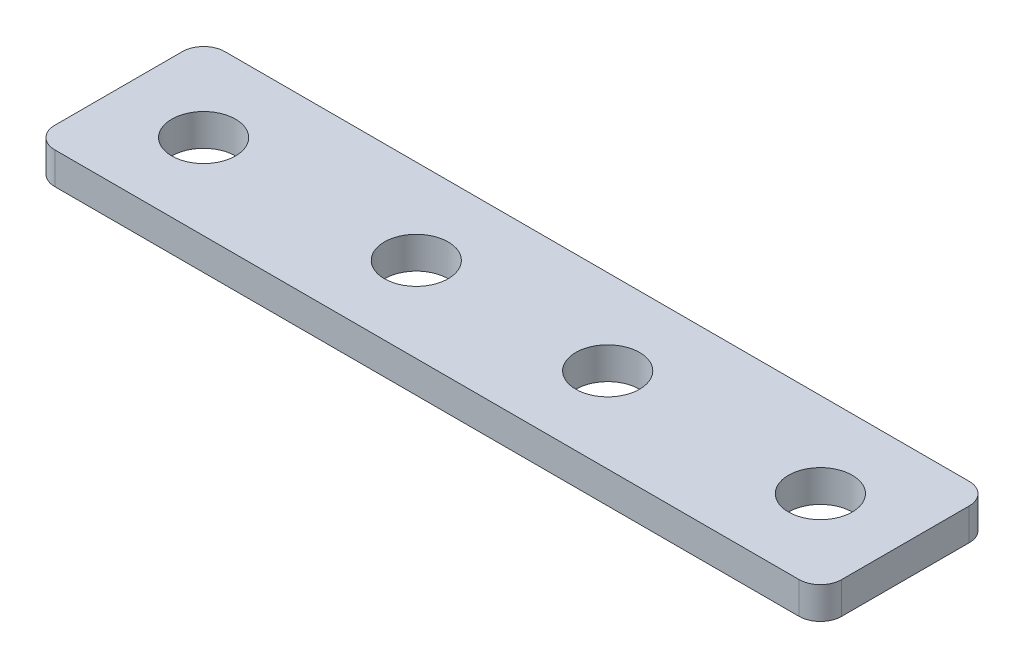
ISO-10303-21;
HEADER;
FILE_DESCRIPTION(('STEP AP214'),'2;1');
FILE_NAME('part.step','',(''),(''),'','','');
FILE_SCHEMA(('AUTOMOTIVE_DESIGN { 1 0 10303 214 1 1 1 1 }'));
ENDSEC;
DATA;
#1=APPLICATION_CONTEXT('core data for automotive mechanical design processes');
#2=APPLICATION_PROTOCOL_DEFINITION('international standard','automotive_design',2000,#1);
#3=PRODUCT_CONTEXT('',#1,'mechanical');
#4=PRODUCT('Part','Part','',(#3));
#5=PRODUCT_RELATED_PRODUCT_CATEGORY('part','',(#4));
#6=PRODUCT_DEFINITION_FORMATION('','',#4);
#7=PRODUCT_DEFINITION_CONTEXT('part definition',#1,'design');
#8=PRODUCT_DEFINITION('design','',#6,#7);
#9=PRODUCT_DEFINITION_SHAPE('','',#8);
#10=(LENGTH_UNIT() NAMED_UNIT(*) SI_UNIT(.MILLI.,.METRE.));
#11=(NAMED_UNIT(*) PLANE_ANGLE_UNIT() SI_UNIT($,.RADIAN.));
#12=(NAMED_UNIT(*) SI_UNIT($,.STERADIAN.) SOLID_ANGLE_UNIT());
#13=UNCERTAINTY_MEASURE_WITH_UNIT(LENGTH_MEASURE(1.E-05),#10,'distance_accuracy_value','');
#14=(GEOMETRIC_REPRESENTATION_CONTEXT(3) GLOBAL_UNCERTAINTY_ASSIGNED_CONTEXT((#13)) GLOBAL_UNIT_ASSIGNED_CONTEXT((#10,
#11,#12)) REPRESENTATION_CONTEXT('',''));
#15=CARTESIAN_POINT('',(0.,0.,0.));
#16=DIRECTION('',(0.,0.,1.));
#17=DIRECTION('',(1.,0.,0.));
#18=AXIS2_PLACEMENT_3D('',#15,#16,#17);
#19=CARTESIAN_POINT('',(0.,1.5,0.));
#20=DIRECTION('',(0.,0.,-1.));
#21=DIRECTION('',(-1.,0.,0.));
#22=AXIS2_PLACEMENT_3D('',#19,#20,#21);
#23=PLANE('',#22);
#24=DIRECTION('',(1.,0.,0.));
#25=VECTOR('',#24,1.);
#26=CARTESIAN_POINT('',(0.,0.,0.));
#27=LINE('',#26,#25);
#28=CARTESIAN_POINT('',(1.,0.,0.));
#29=VERTEX_POINT('',#28);
#30=CARTESIAN_POINT('',(36.,0.,0.));
#31=VERTEX_POINT('',#30);
#32=EDGE_CURVE('E185',#29,#31,#27,.T.);
#33=ORIENTED_EDGE('',*,*,#32,.T.);
#34=DIRECTION('',(0.,-1.,0.));
#35=VECTOR('',#34,1.);
#36=CARTESIAN_POINT('',(36.,1.5,0.));
#37=LINE('',#36,#35);
#38=CARTESIAN_POINT('',(36.,1.5,0.));
#39=VERTEX_POINT('',#38);
#40=EDGE_CURVE('E174',#31,#39,#37,.F.);
#41=ORIENTED_EDGE('',*,*,#40,.T.);
#42=DIRECTION('',(1.,0.,0.));
#43=VECTOR('',#42,1.);
#44=CARTESIAN_POINT('',(0.,1.5,0.));
#45=LINE('',#44,#43);
#46=CARTESIAN_POINT('',(1.,1.5,0.));
#47=VERTEX_POINT('',#46);
#48=EDGE_CURVE('E182',#47,#39,#45,.T.);
#49=ORIENTED_EDGE('',*,*,#48,.F.);
#50=DIRECTION('',(0.,-1.,0.));
#51=VECTOR('',#50,1.);
#52=CARTESIAN_POINT('',(1.,0.,0.));
#53=LINE('',#52,#51);
#54=EDGE_CURVE('E170',#47,#29,#53,.T.);
#55=ORIENTED_EDGE('',*,*,#54,.T.);
#56=EDGE_LOOP('',(#33,#41,#49,#55));
#57=FACE_BOUND('',#56,.T.);
#58=ADVANCED_FACE('F45',(#57),#23,.F.);
#59=CARTESIAN_POINT('',(37.,1.5,0.));
#60=DIRECTION('',(-1.,0.,0.));
#61=DIRECTION('',(0.,0.,1.));
#62=AXIS2_PLACEMENT_3D('',#59,#60,#61);
#63=PLANE('',#62);
#64=DIRECTION('',(0.,0.,-1.));
#65=VECTOR('',#64,1.);
#66=CARTESIAN_POINT('',(37.,0.,0.));
#67=LINE('',#66,#65);
#68=CARTESIAN_POINT('',(37.,0.,-1.));
#69=VERTEX_POINT('',#68);
#70=CARTESIAN_POINT('',(37.,0.,-7.));
#71=VERTEX_POINT('',#70);
#72=EDGE_CURVE('E132',#69,#71,#67,.T.);
#73=ORIENTED_EDGE('',*,*,#72,.T.);
#74=DIRECTION('',(0.,-1.,0.));
#75=VECTOR('',#74,1.);
#76=CARTESIAN_POINT('',(37.,1.5,-7.));
#77=LINE('',#76,#75);
#78=CARTESIAN_POINT('',(37.,1.5,-7.));
#79=VERTEX_POINT('',#78);
#80=EDGE_CURVE('E156',#71,#79,#77,.F.);
#81=ORIENTED_EDGE('',*,*,#80,.T.);
#82=DIRECTION('',(0.,0.,-1.));
#83=VECTOR('',#82,1.);
#84=CARTESIAN_POINT('',(37.,1.5,0.));
#85=LINE('',#84,#83);
#86=CARTESIAN_POINT('',(37.,1.5,-1.));
#87=VERTEX_POINT('',#86);
#88=EDGE_CURVE('E193',#87,#79,#85,.T.);
#89=ORIENTED_EDGE('',*,*,#88,.F.);
#90=DIRECTION('',(0.,-1.,0.));
#91=VECTOR('',#90,1.);
#92=CARTESIAN_POINT('',(37.,1.5,-1.));
#93=LINE('',#92,#91);
#94=EDGE_CURVE('E152',#87,#69,#93,.T.);
#95=ORIENTED_EDGE('',*,*,#94,.T.);
#96=EDGE_LOOP('',(#73,#81,#89,#95));
#97=FACE_BOUND('',#96,.T.);
#98=ADVANCED_FACE('F201',(#97),#63,.F.);
#99=CARTESIAN_POINT('',(0.,1.5,-8.));
#100=DIRECTION('',(0.,0.,-1.));
#101=DIRECTION('',(-1.,0.,0.));
#102=AXIS2_PLACEMENT_3D('',#99,#100,#101);
#103=PLANE('',#102);
#104=DIRECTION('',(1.,0.,0.));
#105=VECTOR('',#104,1.);
#106=CARTESIAN_POINT('',(0.,1.5,-8.));
#107=LINE('',#106,#105);
#108=CARTESIAN_POINT('',(1.,1.5,-8.));
#109=VERTEX_POINT('',#108);
#110=CARTESIAN_POINT('',(36.,1.5,-8.));
#111=VERTEX_POINT('',#110);
#112=EDGE_CURVE('E141',#109,#111,#107,.T.);
#113=ORIENTED_EDGE('',*,*,#112,.T.);
#114=DIRECTION('',(0.,-1.,0.));
#115=VECTOR('',#114,1.);
#116=CARTESIAN_POINT('',(36.,0.,-8.));
#117=LINE('',#116,#115);
#118=CARTESIAN_POINT('',(36.,0.,-8.));
#119=VERTEX_POINT('',#118);
#120=EDGE_CURVE('E130',#111,#119,#117,.T.);
#121=ORIENTED_EDGE('',*,*,#120,.T.);
#122=DIRECTION('',(1.,0.,0.));
#123=VECTOR('',#122,1.);
#124=CARTESIAN_POINT('',(0.,0.,-8.));
#125=LINE('',#124,#123);
#126=CARTESIAN_POINT('',(1.,0.,-8.));
#127=VERTEX_POINT('',#126);
#128=EDGE_CURVE('E115',#127,#119,#125,.T.);
#129=ORIENTED_EDGE('',*,*,#128,.F.);
#130=DIRECTION('',(0.,-1.,0.));
#131=VECTOR('',#130,1.);
#132=CARTESIAN_POINT('',(1.,1.5,-8.));
#133=LINE('',#132,#131);
#134=EDGE_CURVE('E128',#127,#109,#133,.F.);
#135=ORIENTED_EDGE('',*,*,#134,.T.);
#136=EDGE_LOOP('',(#113,#121,#129,#135));
#137=FACE_BOUND('',#136,.T.);
#138=ADVANCED_FACE('F127',(#137),#103,.T.);
#139=CARTESIAN_POINT('',(4.00000000000001,1.5,-4.));
#140=DIRECTION('',(0.,-1.,0.));
#141=DIRECTION('',(0.,0.,-1.));
#142=AXIS2_PLACEMENT_3D('',#139,#140,#141);
#143=CYLINDRICAL_SURFACE('',#142,1.5);
#144=CARTESIAN_POINT('',(4.00000000000001,1.5,-4.));
#145=DIRECTION('',(0.,1.,0.));
#146=DIRECTION('',(0.,0.,1.));
#147=AXIS2_PLACEMENT_3D('',#144,#145,#146);
#148=CIRCLE('',#147,1.5);
#149=CARTESIAN_POINT('',(4.00000000000001,1.5,-2.5));
#150=VERTEX_POINT('',#149);
#151=EDGE_CURVE('E194',#150,#150,#148,.F.);
#152=ORIENTED_EDGE('',*,*,#151,.F.);
#153=EDGE_LOOP('',(#152));
#154=FACE_BOUND('',#153,.T.);
#155=CARTESIAN_POINT('',(4.00000000000001,0.,-4.));
#156=DIRECTION('',(0.,1.,0.));
#157=DIRECTION('',(0.,0.,1.));
#158=AXIS2_PLACEMENT_3D('',#155,#156,#157);
#159=CIRCLE('',#158,1.5);
#160=CARTESIAN_POINT('',(4.00000000000001,0.,-2.5));
#161=VERTEX_POINT('',#160);
#162=EDGE_CURVE('E206',#161,#161,#159,.F.);
#163=ORIENTED_EDGE('',*,*,#162,.T.);
#164=EDGE_LOOP('',(#163));
#165=FACE_BOUND('',#164,.T.);
#166=ADVANCED_FACE('F258',(#154,#165),#143,.F.);
#167=CARTESIAN_POINT('',(14.,1.5,-4.));
#168=DIRECTION('',(0.,-1.,0.));
#169=DIRECTION('',(0.,0.,-1.));
#170=AXIS2_PLACEMENT_3D('',#167,#168,#169);
#171=CYLINDRICAL_SURFACE('',#170,1.5);
#172=CARTESIAN_POINT('',(14.,1.5,-4.));
#173=DIRECTION('',(0.,1.,0.));
#174=DIRECTION('',(0.,0.,1.));
#175=AXIS2_PLACEMENT_3D('',#172,#173,#174);
#176=CIRCLE('',#175,1.5);
#177=CARTESIAN_POINT('',(14.,1.5,-2.5));
#178=VERTEX_POINT('',#177);
#179=EDGE_CURVE('E231',#178,#178,#176,.F.);
#180=ORIENTED_EDGE('',*,*,#179,.F.);
#181=EDGE_LOOP('',(#180));
#182=FACE_BOUND('',#181,.T.);
#183=CARTESIAN_POINT('',(14.,0.,-4.));
#184=DIRECTION('',(0.,1.,0.));
#185=DIRECTION('',(0.,0.,1.));
#186=AXIS2_PLACEMENT_3D('',#183,#184,#185);
#187=CIRCLE('',#186,1.5);
#188=CARTESIAN_POINT('',(14.,0.,-2.5));
#189=VERTEX_POINT('',#188);
#190=EDGE_CURVE('E212',#189,#189,#187,.F.);
#191=ORIENTED_EDGE('',*,*,#190,.T.);
#192=EDGE_LOOP('',(#191));
#193=FACE_BOUND('',#192,.T.);
#194=ADVANCED_FACE('F261',(#182,#193),#171,.F.);
#195=CARTESIAN_POINT('',(23.,1.5,-4.));
#196=DIRECTION('',(0.,-1.,0.));
#197=DIRECTION('',(0.,0.,-1.));
#198=AXIS2_PLACEMENT_3D('',#195,#196,#197);
#199=CYLINDRICAL_SURFACE('',#198,1.5);
#200=CARTESIAN_POINT('',(23.,1.5,-4.));
#201=DIRECTION('',(0.,1.,0.));
#202=DIRECTION('',(0.,0.,1.));
#203=AXIS2_PLACEMENT_3D('',#200,#201,#202);
#204=CIRCLE('',#203,1.5);
#205=CARTESIAN_POINT('',(23.,1.5,-2.5));
#206=VERTEX_POINT('',#205);
#207=EDGE_CURVE('E235',#206,#206,#204,.T.);
#208=ORIENTED_EDGE('',*,*,#207,.T.);
#209=EDGE_LOOP('',(#208));
#210=FACE_BOUND('',#209,.T.);
#211=CARTESIAN_POINT('',(23.,0.,-4.));
#212=DIRECTION('',(0.,1.,0.));
#213=DIRECTION('',(0.,0.,1.));
#214=AXIS2_PLACEMENT_3D('',#211,#212,#213);
#215=CIRCLE('',#214,1.5);
#216=CARTESIAN_POINT('',(23.,0.,-2.5));
#217=VERTEX_POINT('',#216);
#218=EDGE_CURVE('E216',#217,#217,#215,.T.);
#219=ORIENTED_EDGE('',*,*,#218,.F.);
#220=EDGE_LOOP('',(#219));
#221=FACE_BOUND('',#220,.T.);
#222=ADVANCED_FACE('F286',(#210,#221),#199,.F.);
#223=CARTESIAN_POINT('',(33.,1.5,-4.));
#224=DIRECTION('',(0.,-1.,0.));
#225=DIRECTION('',(0.,0.,-1.));
#226=AXIS2_PLACEMENT_3D('',#223,#224,#225);
#227=CYLINDRICAL_SURFACE('',#226,1.5);
#228=CARTESIAN_POINT('',(33.,1.5,-4.));
#229=DIRECTION('',(0.,1.,0.));
#230=DIRECTION('',(0.,0.,1.));
#231=AXIS2_PLACEMENT_3D('',#228,#229,#230);
#232=CIRCLE('',#231,1.5);
#233=CARTESIAN_POINT('',(33.,1.5,-2.5));
#234=VERTEX_POINT('',#233);
#235=EDGE_CURVE('E239',#234,#234,#232,.T.);
#236=ORIENTED_EDGE('',*,*,#235,.T.);
#237=EDGE_LOOP('',(#236));
#238=FACE_BOUND('',#237,.T.);
#239=CARTESIAN_POINT('',(33.,0.,-4.));
#240=DIRECTION('',(0.,1.,0.));
#241=DIRECTION('',(0.,0.,1.));
#242=AXIS2_PLACEMENT_3D('',#239,#240,#241);
#243=CIRCLE('',#242,1.5);
#244=CARTESIAN_POINT('',(33.,0.,-2.5));
#245=VERTEX_POINT('',#244);
#246=EDGE_CURVE('E220',#245,#245,#243,.T.);
#247=ORIENTED_EDGE('',*,*,#246,.F.);
#248=EDGE_LOOP('',(#247));
#249=FACE_BOUND('',#248,.T.);
#250=ADVANCED_FACE('F245',(#238,#249),#227,.F.);
#251=CARTESIAN_POINT('',(0.,1.5,0.));
#252=DIRECTION('',(-1.,0.,0.));
#253=DIRECTION('',(0.,0.,1.));
#254=AXIS2_PLACEMENT_3D('',#251,#252,#253);
#255=PLANE('',#254);
#256=DIRECTION('',(0.,0.,-1.));
#257=VECTOR('',#256,1.);
#258=CARTESIAN_POINT('',(0.,1.5,0.));
#259=LINE('',#258,#257);
#260=CARTESIAN_POINT('',(0.,1.5,-1.));
#261=VERTEX_POINT('',#260);
#262=CARTESIAN_POINT('',(0.,1.5,-7.));
#263=VERTEX_POINT('',#262);
#264=EDGE_CURVE('E136',#261,#263,#259,.T.);
#265=ORIENTED_EDGE('',*,*,#264,.T.);
#266=DIRECTION('',(0.,-1.,0.));
#267=VECTOR('',#266,1.);
#268=CARTESIAN_POINT('',(0.,1.5,-7.));
#269=LINE('',#268,#267);
#270=CARTESIAN_POINT('',(0.,0.,-7.));
#271=VERTEX_POINT('',#270);
#272=EDGE_CURVE('E11',#263,#271,#269,.T.);
#273=ORIENTED_EDGE('',*,*,#272,.T.);
#274=DIRECTION('',(0.,0.,-1.));
#275=VECTOR('',#274,1.);
#276=CARTESIAN_POINT('',(0.,0.,0.));
#277=LINE('',#276,#275);
#278=CARTESIAN_POINT('',(0.,0.,-1.));
#279=VERTEX_POINT('',#278);
#280=EDGE_CURVE('E116',#279,#271,#277,.T.);
#281=ORIENTED_EDGE('',*,*,#280,.F.);
#282=DIRECTION('',(0.,-1.,0.));
#283=VECTOR('',#282,1.);
#284=CARTESIAN_POINT('',(0.,1.5,-1.));
#285=LINE('',#284,#283);
#286=EDGE_CURVE('E54',#279,#261,#285,.F.);
#287=ORIENTED_EDGE('',*,*,#286,.T.);
#288=EDGE_LOOP('',(#265,#273,#281,#287));
#289=FACE_BOUND('',#288,.T.);
#290=ADVANCED_FACE('F250',(#289),#255,.T.);
#291=CARTESIAN_POINT('',(0.,1.5,0.));
#292=DIRECTION('',(0.,1.,0.));
#293=DIRECTION('',(0.,0.,1.));
#294=AXIS2_PLACEMENT_3D('',#291,#292,#293);
#295=PLANE('',#294);
#296=ORIENTED_EDGE('',*,*,#235,.F.);
#297=EDGE_LOOP('',(#296));
#298=FACE_BOUND('',#297,.T.);
#299=ORIENTED_EDGE('',*,*,#207,.F.);
#300=EDGE_LOOP('',(#299));
#301=FACE_BOUND('',#300,.T.);
#302=ORIENTED_EDGE('',*,*,#179,.T.);
#303=EDGE_LOOP('',(#302));
#304=FACE_BOUND('',#303,.T.);
#305=ORIENTED_EDGE('',*,*,#151,.T.);
#306=EDGE_LOOP('',(#305));
#307=FACE_BOUND('',#306,.T.);
#308=ORIENTED_EDGE('',*,*,#88,.T.);
#309=CARTESIAN_POINT('',(36.,1.5,-7.));
#310=DIRECTION('',(0.,1.,0.));
#311=DIRECTION('',(0.,0.,1.));
#312=AXIS2_PLACEMENT_3D('',#309,#310,#311);
#313=CIRCLE('',#312,1.);
#314=EDGE_CURVE('E167',#79,#111,#313,.T.);
#315=ORIENTED_EDGE('',*,*,#314,.T.);
#316=ORIENTED_EDGE('',*,*,#112,.F.);
#317=CARTESIAN_POINT('',(1.,1.5,-7.));
#318=DIRECTION('',(0.,1.,0.));
#319=DIRECTION('',(0.,0.,1.));
#320=AXIS2_PLACEMENT_3D('',#317,#318,#319);
#321=CIRCLE('',#320,1.);
#322=EDGE_CURVE('E61',#109,#263,#321,.T.);
#323=ORIENTED_EDGE('',*,*,#322,.T.);
#324=ORIENTED_EDGE('',*,*,#264,.F.);
#325=CARTESIAN_POINT('',(1.,1.5,-1.));
#326=DIRECTION('',(0.,1.,0.));
#327=DIRECTION('',(0.,0.,1.));
#328=AXIS2_PLACEMENT_3D('',#325,#326,#327);
#329=CIRCLE('',#328,1.);
#330=EDGE_CURVE('E159',#261,#47,#329,.T.);
#331=ORIENTED_EDGE('',*,*,#330,.T.);
#332=ORIENTED_EDGE('',*,*,#48,.T.);
#333=CARTESIAN_POINT('',(36.,1.5,-1.));
#334=DIRECTION('',(0.,1.,0.));
#335=DIRECTION('',(0.,0.,1.));
#336=AXIS2_PLACEMENT_3D('',#333,#334,#335);
#337=CIRCLE('',#336,1.);
#338=EDGE_CURVE('E164',#39,#87,#337,.T.);
#339=ORIENTED_EDGE('',*,*,#338,.T.);
#340=EDGE_LOOP('',(#308,#315,#316,#323,#324,#331,#332,#339));
#341=FACE_BOUND('',#340,.T.);
#342=ADVANCED_FACE('F189',(#298,#301,#304,#307,#341),#295,.T.);
#343=CARTESIAN_POINT('',(0.,0.,0.));
#344=DIRECTION('',(0.,1.,0.));
#345=DIRECTION('',(0.,0.,1.));
#346=AXIS2_PLACEMENT_3D('',#343,#344,#345);
#347=PLANE('',#346);
#348=ORIENTED_EDGE('',*,*,#246,.T.);
#349=EDGE_LOOP('',(#348));
#350=FACE_BOUND('',#349,.T.);
#351=ORIENTED_EDGE('',*,*,#218,.T.);
#352=EDGE_LOOP('',(#351));
#353=FACE_BOUND('',#352,.T.);
#354=ORIENTED_EDGE('',*,*,#190,.F.);
#355=EDGE_LOOP('',(#354));
#356=FACE_BOUND('',#355,.T.);
#357=ORIENTED_EDGE('',*,*,#162,.F.);
#358=EDGE_LOOP('',(#357));
#359=FACE_BOUND('',#358,.T.);
#360=ORIENTED_EDGE('',*,*,#128,.T.);
#361=CARTESIAN_POINT('',(36.,0.,-7.));
#362=DIRECTION('',(0.,1.,0.));
#363=DIRECTION('',(0.,0.,1.));
#364=AXIS2_PLACEMENT_3D('',#361,#362,#363);
#365=CIRCLE('',#364,1.);
#366=EDGE_CURVE('E149',#119,#71,#365,.F.);
#367=ORIENTED_EDGE('',*,*,#366,.T.);
#368=ORIENTED_EDGE('',*,*,#72,.F.);
#369=CARTESIAN_POINT('',(36.,0.,-1.));
#370=DIRECTION('',(0.,1.,0.));
#371=DIRECTION('',(0.,0.,1.));
#372=AXIS2_PLACEMENT_3D('',#369,#370,#371);
#373=CIRCLE('',#372,1.);
#374=EDGE_CURVE('E121',#69,#31,#373,.F.);
#375=ORIENTED_EDGE('',*,*,#374,.T.);
#376=ORIENTED_EDGE('',*,*,#32,.F.);
#377=CARTESIAN_POINT('',(1.,0.,-1.));
#378=DIRECTION('',(0.,1.,0.));
#379=DIRECTION('',(0.,0.,1.));
#380=AXIS2_PLACEMENT_3D('',#377,#378,#379);
#381=CIRCLE('',#380,1.);
#382=EDGE_CURVE('E122',#29,#279,#381,.F.);
#383=ORIENTED_EDGE('',*,*,#382,.T.);
#384=ORIENTED_EDGE('',*,*,#280,.T.);
#385=CARTESIAN_POINT('',(1.,0.,-7.));
#386=DIRECTION('',(0.,1.,0.));
#387=DIRECTION('',(0.,0.,1.));
#388=AXIS2_PLACEMENT_3D('',#385,#386,#387);
#389=CIRCLE('',#388,1.);
#390=EDGE_CURVE('E112',#271,#127,#389,.F.);
#391=ORIENTED_EDGE('',*,*,#390,.T.);
#392=EDGE_LOOP('',(#360,#367,#368,#375,#376,#383,#384,#391));
#393=FACE_BOUND('',#392,.T.);
#394=ADVANCED_FACE('F114',(#350,#353,#356,#359,#393),#347,.F.);
#395=CARTESIAN_POINT('',(36.,1.5,-7.));
#396=DIRECTION('',(0.,1.,0.));
#397=DIRECTION('',(0.,0.,1.));
#398=AXIS2_PLACEMENT_3D('',#395,#396,#397);
#399=CYLINDRICAL_SURFACE('',#398,1.);
#400=ORIENTED_EDGE('',*,*,#314,.F.);
#401=ORIENTED_EDGE('',*,*,#80,.F.);
#402=ORIENTED_EDGE('',*,*,#366,.F.);
#403=ORIENTED_EDGE('',*,*,#120,.F.);
#404=EDGE_LOOP('',(#400,#401,#402,#403));
#405=FACE_BOUND('',#404,.T.);
#406=ADVANCED_FACE('F266',(#405),#399,.T.);
#407=CARTESIAN_POINT('',(36.,1.5,-1.));
#408=DIRECTION('',(0.,-1.,0.));
#409=DIRECTION('',(0.,0.,-1.));
#410=AXIS2_PLACEMENT_3D('',#407,#408,#409);
#411=CYLINDRICAL_SURFACE('',#410,1.);
#412=ORIENTED_EDGE('',*,*,#338,.F.);
#413=ORIENTED_EDGE('',*,*,#40,.F.);
#414=ORIENTED_EDGE('',*,*,#374,.F.);
#415=ORIENTED_EDGE('',*,*,#94,.F.);
#416=EDGE_LOOP('',(#412,#413,#414,#415));
#417=FACE_BOUND('',#416,.T.);
#418=ADVANCED_FACE('F197',(#417),#411,.T.);
#419=CARTESIAN_POINT('',(1.,1.5,-7.));
#420=DIRECTION('',(0.,-1.,0.));
#421=DIRECTION('',(0.,0.,-1.));
#422=AXIS2_PLACEMENT_3D('',#419,#420,#421);
#423=CYLINDRICAL_SURFACE('',#422,1.);
#424=ORIENTED_EDGE('',*,*,#322,.F.);
#425=ORIENTED_EDGE('',*,*,#134,.F.);
#426=ORIENTED_EDGE('',*,*,#390,.F.);
#427=ORIENTED_EDGE('',*,*,#272,.F.);
#428=EDGE_LOOP('',(#424,#425,#426,#427));
#429=FACE_BOUND('',#428,.T.);
#430=ADVANCED_FACE('F134',(#429),#423,.T.);
#431=CARTESIAN_POINT('',(1.,1.5,-1.));
#432=DIRECTION('',(0.,1.,0.));
#433=DIRECTION('',(0.,0.,1.));
#434=AXIS2_PLACEMENT_3D('',#431,#432,#433);
#435=CYLINDRICAL_SURFACE('',#434,1.);
#436=ORIENTED_EDGE('',*,*,#330,.F.);
#437=ORIENTED_EDGE('',*,*,#286,.F.);
#438=ORIENTED_EDGE('',*,*,#382,.F.);
#439=ORIENTED_EDGE('',*,*,#54,.F.);
#440=EDGE_LOOP('',(#436,#437,#438,#439));
#441=FACE_BOUND('',#440,.T.);
#442=ADVANCED_FACE('F47',(#441),#435,.T.);
#443=CLOSED_SHELL('',(#58,#98,#138,#166,#194,#222,#250,#290,#342,#394,#406,#418,#430,#442));
#444=MANIFOLD_SOLID_BREP('B2',#443);
#445=ADVANCED_BREP_SHAPE_REPRESENTATION('',(#18,#444),#14);
#446=SHAPE_DEFINITION_REPRESENTATION(#9,#445);
ENDSEC;
END-ISO-10303-21;
